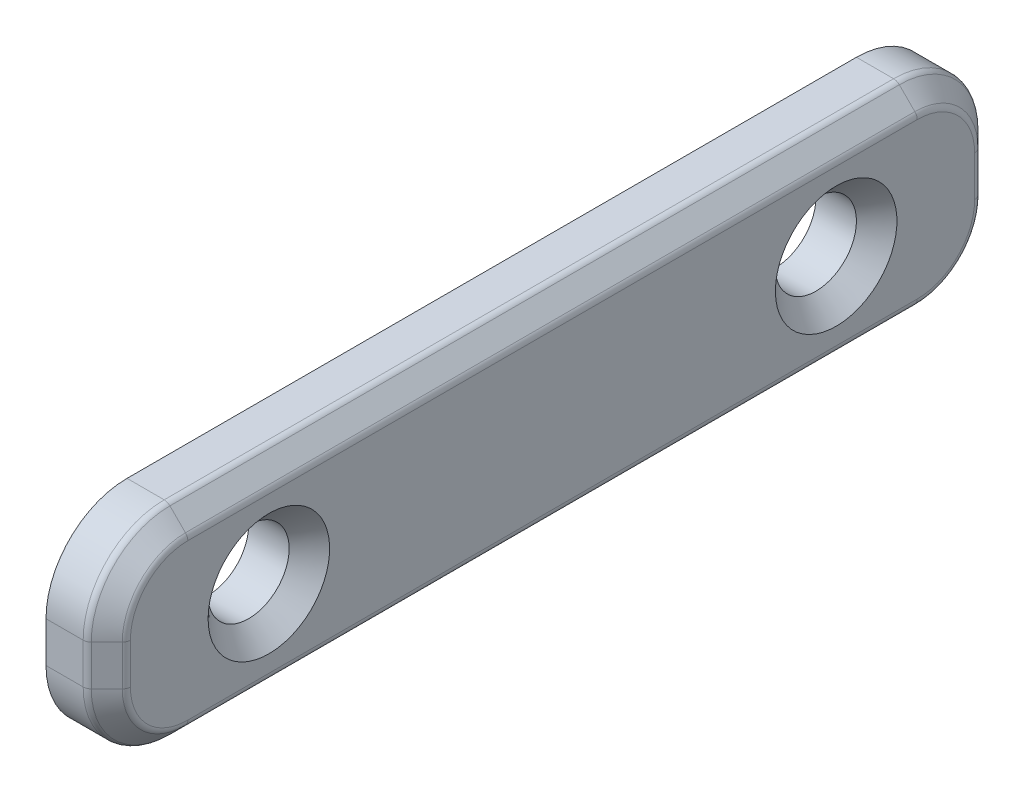
ISO-10303-21;
HEADER;
FILE_DESCRIPTION(('STEP AP214'),'2;1');
FILE_NAME('part.step','',(''),(''),'','','');
FILE_SCHEMA(('AUTOMOTIVE_DESIGN { 1 0 10303 214 1 1 1 1 }'));
ENDSEC;
DATA;
#1=APPLICATION_CONTEXT('core data for automotive mechanical design processes');
#2=APPLICATION_PROTOCOL_DEFINITION('international standard','automotive_design',2000,#1);
#3=PRODUCT_CONTEXT('',#1,'mechanical');
#4=PRODUCT('Part','Part','',(#3));
#5=PRODUCT_RELATED_PRODUCT_CATEGORY('part','',(#4));
#6=PRODUCT_DEFINITION_FORMATION('','',#4);
#7=PRODUCT_DEFINITION_CONTEXT('part definition',#1,'design');
#8=PRODUCT_DEFINITION('design','',#6,#7);
#9=PRODUCT_DEFINITION_SHAPE('','',#8);
#10=(LENGTH_UNIT() NAMED_UNIT(*) SI_UNIT(.MILLI.,.METRE.));
#11=(NAMED_UNIT(*) PLANE_ANGLE_UNIT() SI_UNIT($,.RADIAN.));
#12=(NAMED_UNIT(*) SI_UNIT($,.STERADIAN.) SOLID_ANGLE_UNIT());
#13=UNCERTAINTY_MEASURE_WITH_UNIT(LENGTH_MEASURE(1.E-05),#10,'distance_accuracy_value','');
#14=(GEOMETRIC_REPRESENTATION_CONTEXT(3) GLOBAL_UNCERTAINTY_ASSIGNED_CONTEXT((#13)) GLOBAL_UNIT_ASSIGNED_CONTEXT((#10,
#11,#12)) REPRESENTATION_CONTEXT('',''));
#15=CARTESIAN_POINT('',(0.,0.,0.));
#16=DIRECTION('',(0.,0.,1.));
#17=DIRECTION('',(1.,0.,0.));
#18=AXIS2_PLACEMENT_3D('',#15,#16,#17);
#19=CARTESIAN_POINT('',(3.,1.,-18.));
#20=DIRECTION('',(-1.,0.,0.));
#21=DIRECTION('',(0.,0.,1.));
#22=AXIS2_PLACEMENT_3D('',#19,#20,#21);
#23=PLANE('',#22);
#24=CARTESIAN_POINT('',(3.,0.,14.));
#25=DIRECTION('',(-1.,0.,0.));
#26=DIRECTION('',(0.,0.,1.));
#27=AXIS2_PLACEMENT_3D('',#24,#25,#26);
#28=CIRCLE('',#27,3.00000000000001);
#29=CARTESIAN_POINT('',(3.,0.,17.));
#30=VERTEX_POINT('',#29);
#31=EDGE_CURVE('E49',#30,#30,#28,.T.);
#32=ORIENTED_EDGE('',*,*,#31,.T.);
#33=EDGE_LOOP('',(#32));
#34=FACE_BOUND('',#33,.T.);
#35=CARTESIAN_POINT('',(3.,0.,-14.));
#36=DIRECTION('',(-1.,0.,0.));
#37=DIRECTION('',(0.,0.,1.));
#38=AXIS2_PLACEMENT_3D('',#35,#36,#37);
#39=CIRCLE('',#38,2.99999999999999);
#40=CARTESIAN_POINT('',(3.,0.,-11.));
#41=VERTEX_POINT('',#40);
#42=EDGE_CURVE('E372',#41,#41,#39,.T.);
#43=ORIENTED_EDGE('',*,*,#42,.T.);
#44=EDGE_LOOP('',(#43));
#45=FACE_BOUND('',#44,.T.);
#46=DIRECTION('',(0.,-1.,0.));
#47=VECTOR('',#46,1.);
#48=CARTESIAN_POINT('',(3.,0.999999999999971,-20.8343145750508));
#49=LINE('',#48,#47);
#50=CARTESIAN_POINT('',(3.,-1.,-20.8343145750508));
#51=VERTEX_POINT('',#50);
#52=CARTESIAN_POINT('',(3.,0.999999999999973,-20.8343145750508));
#53=VERTEX_POINT('',#52);
#54=EDGE_CURVE('E60',#51,#53,#49,.F.);
#55=ORIENTED_EDGE('',*,*,#54,.T.);
#56=CARTESIAN_POINT('',(3.,1.,-18.));
#57=DIRECTION('',(-1.,0.,0.));
#58=DIRECTION('',(0.,0.,1.));
#59=AXIS2_PLACEMENT_3D('',#56,#57,#58);
#60=CIRCLE('',#59,2.83431457505076);
#61=CARTESIAN_POINT('',(3.,3.83431457505076,-18.));
#62=VERTEX_POINT('',#61);
#63=EDGE_CURVE('E319',#53,#62,#60,.F.);
#64=ORIENTED_EDGE('',*,*,#63,.T.);
#65=DIRECTION('',(0.,0.,-1.));
#66=VECTOR('',#65,1.);
#67=CARTESIAN_POINT('',(3.,3.83431457505076,18.));
#68=LINE('',#67,#66);
#69=CARTESIAN_POINT('',(3.,3.83431457505076,18.));
#70=VERTEX_POINT('',#69);
#71=EDGE_CURVE('E306',#62,#70,#68,.F.);
#72=ORIENTED_EDGE('',*,*,#71,.T.);
#73=CARTESIAN_POINT('',(3.,1.,18.));
#74=DIRECTION('',(-1.,0.,0.));
#75=DIRECTION('',(0.,0.,1.));
#76=AXIS2_PLACEMENT_3D('',#73,#74,#75);
#77=CIRCLE('',#76,2.83431457505076);
#78=CARTESIAN_POINT('',(3.,0.999999999999972,20.8343145750508));
#79=VERTEX_POINT('',#78);
#80=EDGE_CURVE('E309',#70,#79,#77,.F.);
#81=ORIENTED_EDGE('',*,*,#80,.T.);
#82=DIRECTION('',(0.,1.,0.));
#83=VECTOR('',#82,1.);
#84=CARTESIAN_POINT('',(3.,-0.99999999999998,20.8343145750508));
#85=LINE('',#84,#83);
#86=CARTESIAN_POINT('',(3.,-0.999999999999981,20.8343145750508));
#87=VERTEX_POINT('',#86);
#88=EDGE_CURVE('E315',#79,#87,#85,.F.);
#89=ORIENTED_EDGE('',*,*,#88,.T.);
#90=CARTESIAN_POINT('',(3.,-1.,18.));
#91=DIRECTION('',(-1.,0.,0.));
#92=DIRECTION('',(0.,0.,1.));
#93=AXIS2_PLACEMENT_3D('',#90,#91,#92);
#94=CIRCLE('',#93,2.83431457505076);
#95=CARTESIAN_POINT('',(3.,-3.83431457505076,18.));
#96=VERTEX_POINT('',#95);
#97=EDGE_CURVE('E314',#87,#96,#94,.F.);
#98=ORIENTED_EDGE('',*,*,#97,.T.);
#99=DIRECTION('',(0.,0.,1.));
#100=VECTOR('',#99,1.);
#101=CARTESIAN_POINT('',(3.,-3.83431457505076,-18.));
#102=LINE('',#101,#100);
#103=CARTESIAN_POINT('',(3.,-3.83431457505076,-18.));
#104=VERTEX_POINT('',#103);
#105=EDGE_CURVE('E316',#96,#104,#102,.F.);
#106=ORIENTED_EDGE('',*,*,#105,.T.);
#107=CARTESIAN_POINT('',(3.,-1.,-18.));
#108=DIRECTION('',(-1.,0.,0.));
#109=DIRECTION('',(0.,0.,1.));
#110=AXIS2_PLACEMENT_3D('',#107,#108,#109);
#111=CIRCLE('',#110,2.83431457505076);
#112=EDGE_CURVE('E64',#104,#51,#111,.F.);
#113=ORIENTED_EDGE('',*,*,#112,.T.);
#114=EDGE_LOOP('',(#55,#64,#72,#81,#89,#98,#106,#113));
#115=FACE_BOUND('',#114,.T.);
#116=ADVANCED_FACE('F41',(#34,#45,#115),#23,.F.);
#117=CARTESIAN_POINT('',(0.,1.,-18.));
#118=DIRECTION('',(-1.,0.,0.));
#119=DIRECTION('',(0.,0.,1.));
#120=AXIS2_PLACEMENT_3D('',#117,#118,#119);
#121=PLANE('',#120);
#122=CARTESIAN_POINT('',(0.,0.,-14.));
#123=DIRECTION('',(1.,0.,0.));
#124=DIRECTION('',(0.,0.,-1.));
#125=AXIS2_PLACEMENT_3D('',#122,#123,#124);
#126=CIRCLE('',#125,2.);
#127=CARTESIAN_POINT('',(0.,0.,-16.));
#128=VERTEX_POINT('',#127);
#129=EDGE_CURVE('E213',#128,#128,#126,.F.);
#130=ORIENTED_EDGE('',*,*,#129,.F.);
#131=EDGE_LOOP('',(#130));
#132=FACE_BOUND('',#131,.T.);
#133=CARTESIAN_POINT('',(0.,1.,-18.));
#134=DIRECTION('',(1.,0.,0.));
#135=DIRECTION('',(0.,0.,1.));
#136=AXIS2_PLACEMENT_3D('',#133,#134,#135);
#137=CIRCLE('',#136,4.);
#138=CARTESIAN_POINT('',(0.,0.999999999999971,-22.));
#139=VERTEX_POINT('',#138);
#140=CARTESIAN_POINT('',(0.,5.,-18.));
#141=VERTEX_POINT('',#140);
#142=EDGE_CURVE('E196',#139,#141,#137,.T.);
#143=ORIENTED_EDGE('',*,*,#142,.F.);
#144=DIRECTION('',(0.,1.,0.));
#145=VECTOR('',#144,1.);
#146=CARTESIAN_POINT('',(0.,-0.999999999999972,-22.));
#147=LINE('',#146,#145);
#148=CARTESIAN_POINT('',(0.,-1.,-22.));
#149=VERTEX_POINT('',#148);
#150=EDGE_CURVE('E230',#149,#139,#147,.T.);
#151=ORIENTED_EDGE('',*,*,#150,.F.);
#152=CARTESIAN_POINT('',(0.,-1.,-18.));
#153=DIRECTION('',(1.,0.,0.));
#154=DIRECTION('',(0.,0.,-1.));
#155=AXIS2_PLACEMENT_3D('',#152,#153,#154);
#156=CIRCLE('',#155,4.);
#157=CARTESIAN_POINT('',(0.,-5.,-18.));
#158=VERTEX_POINT('',#157);
#159=EDGE_CURVE('E228',#158,#149,#156,.T.);
#160=ORIENTED_EDGE('',*,*,#159,.F.);
#161=DIRECTION('',(0.,0.,-1.));
#162=VECTOR('',#161,1.);
#163=CARTESIAN_POINT('',(0.,-5.,18.));
#164=LINE('',#163,#162);
#165=CARTESIAN_POINT('',(0.,-5.,18.));
#166=VERTEX_POINT('',#165);
#167=EDGE_CURVE('E224',#166,#158,#164,.T.);
#168=ORIENTED_EDGE('',*,*,#167,.F.);
#169=CARTESIAN_POINT('',(0.,-1.,18.));
#170=DIRECTION('',(1.,0.,0.));
#171=DIRECTION('',(0.,0.,1.));
#172=AXIS2_PLACEMENT_3D('',#169,#170,#171);
#173=CIRCLE('',#172,4.);
#174=CARTESIAN_POINT('',(0.,-0.999999999999972,22.));
#175=VERTEX_POINT('',#174);
#176=EDGE_CURVE('E219',#175,#166,#173,.T.);
#177=ORIENTED_EDGE('',*,*,#176,.F.);
#178=DIRECTION('',(0.,-1.,0.));
#179=VECTOR('',#178,1.);
#180=CARTESIAN_POINT('',(0.,-0.999999999999972,22.));
#181=LINE('',#180,#179);
#182=CARTESIAN_POINT('',(0.,0.999999999999972,22.));
#183=VERTEX_POINT('',#182);
#184=EDGE_CURVE('E220',#183,#175,#181,.T.);
#185=ORIENTED_EDGE('',*,*,#184,.F.);
#186=CARTESIAN_POINT('',(0.,1.,18.));
#187=DIRECTION('',(1.,0.,0.));
#188=DIRECTION('',(0.,0.,-1.));
#189=AXIS2_PLACEMENT_3D('',#186,#187,#188);
#190=CIRCLE('',#189,4.);
#191=CARTESIAN_POINT('',(0.,5.,18.));
#192=VERTEX_POINT('',#191);
#193=EDGE_CURVE('E203',#192,#183,#190,.T.);
#194=ORIENTED_EDGE('',*,*,#193,.F.);
#195=DIRECTION('',(0.,0.,1.));
#196=VECTOR('',#195,1.);
#197=CARTESIAN_POINT('',(0.,5.,18.));
#198=LINE('',#197,#196);
#199=EDGE_CURVE('E181',#141,#192,#198,.T.);
#200=ORIENTED_EDGE('',*,*,#199,.F.);
#201=EDGE_LOOP('',(#143,#151,#160,#168,#177,#185,#194,#200));
#202=FACE_BOUND('',#201,.T.);
#203=CARTESIAN_POINT('',(0.,0.,14.));
#204=DIRECTION('',(1.,0.,0.));
#205=DIRECTION('',(0.,0.,-1.));
#206=AXIS2_PLACEMENT_3D('',#203,#204,#205);
#207=CIRCLE('',#206,2.);
#208=CARTESIAN_POINT('',(0.,0.,12.));
#209=VERTEX_POINT('',#208);
#210=EDGE_CURVE('E352',#209,#209,#207,.T.);
#211=ORIENTED_EDGE('',*,*,#210,.T.);
#212=EDGE_LOOP('',(#211));
#213=FACE_BOUND('',#212,.T.);
#214=ADVANCED_FACE('F194',(#132,#202,#213),#121,.T.);
#215=CARTESIAN_POINT('',(3.,1.,-18.));
#216=DIRECTION('',(-1.,0.,0.));
#217=DIRECTION('',(0.,0.,1.));
#218=AXIS2_PLACEMENT_3D('',#215,#216,#217);
#219=CYLINDRICAL_SURFACE('',#218,4.);
#220=DIRECTION('',(-1.,0.,0.));
#221=VECTOR('',#220,1.);
#222=CARTESIAN_POINT('',(3.,5.,-18.));
#223=LINE('',#222,#221);
#224=CARTESIAN_POINT('',(1.83431457505075,5.,-18.));
#225=VERTEX_POINT('',#224);
#226=EDGE_CURVE('E177',#225,#141,#223,.T.);
#227=ORIENTED_EDGE('',*,*,#226,.F.);
#228=CARTESIAN_POINT('',(1.83431457505075,1.,-18.));
#229=DIRECTION('',(1.,0.,0.));
#230=DIRECTION('',(0.,0.,-1.));
#231=AXIS2_PLACEMENT_3D('',#228,#229,#230);
#232=CIRCLE('',#231,4.);
#233=CARTESIAN_POINT('',(1.83431457505075,0.999999999999971,-22.));
#234=VERTEX_POINT('',#233);
#235=EDGE_CURVE('E303',#225,#234,#232,.F.);
#236=ORIENTED_EDGE('',*,*,#235,.T.);
#237=DIRECTION('',(-1.,0.,0.));
#238=VECTOR('',#237,1.);
#239=CARTESIAN_POINT('',(3.,0.999999999999971,-22.));
#240=LINE('',#239,#238);
#241=EDGE_CURVE('E202',#234,#139,#240,.T.);
#242=ORIENTED_EDGE('',*,*,#241,.T.);
#243=ORIENTED_EDGE('',*,*,#142,.T.);
#244=EDGE_LOOP('',(#227,#236,#242,#243));
#245=FACE_BOUND('',#244,.T.);
#246=ADVANCED_FACE('F201',(#245),#219,.T.);
#247=CARTESIAN_POINT('',(3.,5.,18.));
#248=DIRECTION('',(0.,-1.,0.));
#249=DIRECTION('',(0.,0.,-1.));
#250=AXIS2_PLACEMENT_3D('',#247,#248,#249);
#251=PLANE('',#250);
#252=DIRECTION('',(-1.,0.,0.));
#253=VECTOR('',#252,1.);
#254=CARTESIAN_POINT('',(3.,5.,18.));
#255=LINE('',#254,#253);
#256=CARTESIAN_POINT('',(1.83431457505075,5.,18.));
#257=VERTEX_POINT('',#256);
#258=EDGE_CURVE('E193',#257,#192,#255,.T.);
#259=ORIENTED_EDGE('',*,*,#258,.F.);
#260=DIRECTION('',(0.,0.,1.));
#261=VECTOR('',#260,1.);
#262=CARTESIAN_POINT('',(1.83431457505075,5.,-18.));
#263=LINE('',#262,#261);
#264=EDGE_CURVE('E186',#257,#225,#263,.F.);
#265=ORIENTED_EDGE('',*,*,#264,.T.);
#266=ORIENTED_EDGE('',*,*,#226,.T.);
#267=ORIENTED_EDGE('',*,*,#199,.T.);
#268=EDGE_LOOP('',(#259,#265,#266,#267));
#269=FACE_BOUND('',#268,.T.);
#270=ADVANCED_FACE('F185',(#269),#251,.F.);
#271=CARTESIAN_POINT('',(3.,1.,18.));
#272=DIRECTION('',(-1.,0.,0.));
#273=DIRECTION('',(0.,0.,1.));
#274=AXIS2_PLACEMENT_3D('',#271,#272,#273);
#275=CYLINDRICAL_SURFACE('',#274,4.);
#276=DIRECTION('',(-1.,0.,0.));
#277=VECTOR('',#276,1.);
#278=CARTESIAN_POINT('',(3.,0.999999999999972,22.));
#279=LINE('',#278,#277);
#280=CARTESIAN_POINT('',(1.83431457505075,0.999999999999972,22.));
#281=VERTEX_POINT('',#280);
#282=EDGE_CURVE('E238',#281,#183,#279,.T.);
#283=ORIENTED_EDGE('',*,*,#282,.F.);
#284=CARTESIAN_POINT('',(1.83431457505075,1.,18.));
#285=DIRECTION('',(1.,0.,0.));
#286=DIRECTION('',(0.,0.,-1.));
#287=AXIS2_PLACEMENT_3D('',#284,#285,#286);
#288=CIRCLE('',#287,4.);
#289=EDGE_CURVE('E189',#281,#257,#288,.F.);
#290=ORIENTED_EDGE('',*,*,#289,.T.);
#291=ORIENTED_EDGE('',*,*,#258,.T.);
#292=ORIENTED_EDGE('',*,*,#193,.T.);
#293=EDGE_LOOP('',(#283,#290,#291,#292));
#294=FACE_BOUND('',#293,.T.);
#295=ADVANCED_FACE('F428',(#294),#275,.T.);
#296=CARTESIAN_POINT('',(3.,-0.999999999999972,22.));
#297=DIRECTION('',(0.,0.,-1.));
#298=DIRECTION('',(-1.,0.,0.));
#299=AXIS2_PLACEMENT_3D('',#296,#297,#298);
#300=PLANE('',#299);
#301=DIRECTION('',(-1.,0.,0.));
#302=VECTOR('',#301,1.);
#303=CARTESIAN_POINT('',(3.,-0.999999999999972,22.));
#304=LINE('',#303,#302);
#305=CARTESIAN_POINT('',(1.83431457505075,-0.999999999999972,22.));
#306=VERTEX_POINT('',#305);
#307=EDGE_CURVE('E236',#306,#175,#304,.T.);
#308=ORIENTED_EDGE('',*,*,#307,.F.);
#309=DIRECTION('',(0.,-1.,0.));
#310=VECTOR('',#309,1.);
#311=CARTESIAN_POINT('',(1.83431457505075,0.999999999999972,22.));
#312=LINE('',#311,#310);
#313=EDGE_CURVE('E271',#306,#281,#312,.F.);
#314=ORIENTED_EDGE('',*,*,#313,.T.);
#315=ORIENTED_EDGE('',*,*,#282,.T.);
#316=ORIENTED_EDGE('',*,*,#184,.T.);
#317=EDGE_LOOP('',(#308,#314,#315,#316));
#318=FACE_BOUND('',#317,.T.);
#319=ADVANCED_FACE('F424',(#318),#300,.F.);
#320=CARTESIAN_POINT('',(3.,-1.,18.));
#321=DIRECTION('',(-1.,0.,0.));
#322=DIRECTION('',(0.,0.,1.));
#323=AXIS2_PLACEMENT_3D('',#320,#321,#322);
#324=CYLINDRICAL_SURFACE('',#323,4.);
#325=DIRECTION('',(-1.,0.,0.));
#326=VECTOR('',#325,1.);
#327=CARTESIAN_POINT('',(3.,-5.,18.));
#328=LINE('',#327,#326);
#329=CARTESIAN_POINT('',(1.83431457505075,-5.,18.));
#330=VERTEX_POINT('',#329);
#331=EDGE_CURVE('E237',#330,#166,#328,.T.);
#332=ORIENTED_EDGE('',*,*,#331,.F.);
#333=CARTESIAN_POINT('',(1.83431457505075,-1.,18.));
#334=DIRECTION('',(1.,0.,0.));
#335=DIRECTION('',(0.,0.,-1.));
#336=AXIS2_PLACEMENT_3D('',#333,#334,#335);
#337=CIRCLE('',#336,4.);
#338=EDGE_CURVE('E280',#330,#306,#337,.F.);
#339=ORIENTED_EDGE('',*,*,#338,.T.);
#340=ORIENTED_EDGE('',*,*,#307,.T.);
#341=ORIENTED_EDGE('',*,*,#176,.T.);
#342=EDGE_LOOP('',(#332,#339,#340,#341));
#343=FACE_BOUND('',#342,.T.);
#344=ADVANCED_FACE('F419',(#343),#324,.T.);
#345=CARTESIAN_POINT('',(3.,-5.,18.));
#346=DIRECTION('',(0.,1.,0.));
#347=DIRECTION('',(0.,0.,1.));
#348=AXIS2_PLACEMENT_3D('',#345,#346,#347);
#349=PLANE('',#348);
#350=DIRECTION('',(-1.,0.,0.));
#351=VECTOR('',#350,1.);
#352=CARTESIAN_POINT('',(3.,-5.,-18.));
#353=LINE('',#352,#351);
#354=CARTESIAN_POINT('',(1.83431457505075,-5.,-18.));
#355=VERTEX_POINT('',#354);
#356=EDGE_CURVE('E232',#355,#158,#353,.T.);
#357=ORIENTED_EDGE('',*,*,#356,.F.);
#358=DIRECTION('',(0.,0.,-1.));
#359=VECTOR('',#358,1.);
#360=CARTESIAN_POINT('',(1.83431457505075,-5.,18.));
#361=LINE('',#360,#359);
#362=EDGE_CURVE('E282',#355,#330,#361,.F.);
#363=ORIENTED_EDGE('',*,*,#362,.T.);
#364=ORIENTED_EDGE('',*,*,#331,.T.);
#365=ORIENTED_EDGE('',*,*,#167,.T.);
#366=EDGE_LOOP('',(#357,#363,#364,#365));
#367=FACE_BOUND('',#366,.T.);
#368=ADVANCED_FACE('F418',(#367),#349,.F.);
#369=CARTESIAN_POINT('',(3.,-1.,-18.));
#370=DIRECTION('',(-1.,0.,0.));
#371=DIRECTION('',(0.,0.,1.));
#372=AXIS2_PLACEMENT_3D('',#369,#370,#371);
#373=CYLINDRICAL_SURFACE('',#372,4.);
#374=DIRECTION('',(-1.,0.,0.));
#375=VECTOR('',#374,1.);
#376=CARTESIAN_POINT('',(3.,-1.,-22.));
#377=LINE('',#376,#375);
#378=CARTESIAN_POINT('',(1.83431457505075,-1.,-22.));
#379=VERTEX_POINT('',#378);
#380=EDGE_CURVE('E235',#379,#149,#377,.T.);
#381=ORIENTED_EDGE('',*,*,#380,.F.);
#382=CARTESIAN_POINT('',(1.83431457505075,-1.,-18.));
#383=DIRECTION('',(1.,0.,0.));
#384=DIRECTION('',(0.,0.,-1.));
#385=AXIS2_PLACEMENT_3D('',#382,#383,#384);
#386=CIRCLE('',#385,4.);
#387=EDGE_CURVE('E287',#379,#355,#386,.F.);
#388=ORIENTED_EDGE('',*,*,#387,.T.);
#389=ORIENTED_EDGE('',*,*,#356,.T.);
#390=ORIENTED_EDGE('',*,*,#159,.T.);
#391=EDGE_LOOP('',(#381,#388,#389,#390));
#392=FACE_BOUND('',#391,.T.);
#393=ADVANCED_FACE('F415',(#392),#373,.T.);
#394=CARTESIAN_POINT('',(3.,-0.999999999999972,-22.));
#395=DIRECTION('',(0.,0.,1.));
#396=DIRECTION('',(1.,0.,0.));
#397=AXIS2_PLACEMENT_3D('',#394,#395,#396);
#398=PLANE('',#397);
#399=ORIENTED_EDGE('',*,*,#241,.F.);
#400=DIRECTION('',(0.,1.,0.));
#401=VECTOR('',#400,1.);
#402=CARTESIAN_POINT('',(1.83431457505075,-1.,-22.));
#403=LINE('',#402,#401);
#404=EDGE_CURVE('E293',#234,#379,#403,.F.);
#405=ORIENTED_EDGE('',*,*,#404,.T.);
#406=ORIENTED_EDGE('',*,*,#380,.T.);
#407=ORIENTED_EDGE('',*,*,#150,.T.);
#408=EDGE_LOOP('',(#399,#405,#406,#407));
#409=FACE_BOUND('',#408,.T.);
#410=ADVANCED_FACE('F407',(#409),#398,.F.);
#411=CARTESIAN_POINT('',(3.,1.,21.));
#412=DIRECTION('',(-0.707106781186545,0.,-0.70710678118655));
#413=DIRECTION('',(0.,-1.,0.));
#414=AXIS2_PLACEMENT_3D('',#411,#412,#413);
#415=PLANE('',#414);
#416=DIRECTION('',(0.70710678118655,0.,-0.707106781186545));
#417=VECTOR('',#416,1.);
#418=CARTESIAN_POINT('',(1.99999999999999,0.999999999999972,22.));
#419=LINE('',#418,#417);
#420=CARTESIAN_POINT('',(2.11715728752537,0.999999999999972,21.8828427124746));
#421=VERTEX_POINT('',#420);
#422=CARTESIAN_POINT('',(2.88284271247462,0.999999999999972,21.1171572875254));
#423=VERTEX_POINT('',#422);
#424=EDGE_CURVE('E209',#421,#423,#419,.T.);
#425=ORIENTED_EDGE('',*,*,#424,.F.);
#426=DIRECTION('',(0.,1.,0.));
#427=VECTOR('',#426,1.);
#428=CARTESIAN_POINT('',(2.11715728752537,-0.999999999999972,21.8828427124746));
#429=LINE('',#428,#427);
#430=CARTESIAN_POINT('',(2.11715728752537,-0.999999999999973,21.8828427124746));
#431=VERTEX_POINT('',#430);
#432=EDGE_CURVE('E274',#421,#431,#429,.F.);
#433=ORIENTED_EDGE('',*,*,#432,.T.);
#434=DIRECTION('',(-0.70710678118655,0.,0.707106781186545));
#435=VECTOR('',#434,1.);
#436=CARTESIAN_POINT('',(3.,-0.99999999999998,21.));
#437=LINE('',#436,#435);
#438=CARTESIAN_POINT('',(2.88284271247461,-0.999999999999979,21.1171572875254));
#439=VERTEX_POINT('',#438);
#440=EDGE_CURVE('E210',#439,#431,#437,.T.);
#441=ORIENTED_EDGE('',*,*,#440,.F.);
#442=DIRECTION('',(0.,-1.,0.));
#443=VECTOR('',#442,1.);
#444=CARTESIAN_POINT('',(2.88284271247461,0.999999999999972,21.1171572875254));
#445=LINE('',#444,#443);
#446=EDGE_CURVE('E272',#439,#423,#445,.F.);
#447=ORIENTED_EDGE('',*,*,#446,.T.);
#448=EDGE_LOOP('',(#425,#433,#441,#447));
#449=FACE_BOUND('',#448,.T.);
#450=ADVANCED_FACE('F413',(#449),#415,.F.);
#451=CARTESIAN_POINT('',(3.,-1.,18.));
#452=DIRECTION('',(-1.,0.,0.));
#453=DIRECTION('',(0.,0.,1.));
#454=AXIS2_PLACEMENT_3D('',#451,#452,#453);
#455=CONICAL_SURFACE('',#454,3.,0.785398163397445);
#456=ORIENTED_EDGE('',*,*,#440,.T.);
#457=CARTESIAN_POINT('',(2.11715728752537,-1.,18.));
#458=DIRECTION('',(-1.,0.,0.));
#459=DIRECTION('',(0.,0.,1.));
#460=AXIS2_PLACEMENT_3D('',#457,#458,#459);
#461=CIRCLE('',#460,3.88284271247462);
#462=CARTESIAN_POINT('',(2.11715728752537,-4.88284271247462,18.));
#463=VERTEX_POINT('',#462);
#464=EDGE_CURVE('E283',#431,#463,#461,.F.);
#465=ORIENTED_EDGE('',*,*,#464,.T.);
#466=DIRECTION('',(-0.70710678118655,-0.707106781186545,0.));
#467=VECTOR('',#466,1.);
#468=CARTESIAN_POINT('',(3.,-4.,18.));
#469=LINE('',#468,#467);
#470=CARTESIAN_POINT('',(2.88284271247462,-4.11715728752538,18.));
#471=VERTEX_POINT('',#470);
#472=EDGE_CURVE('E259',#471,#463,#469,.T.);
#473=ORIENTED_EDGE('',*,*,#472,.F.);
#474=CARTESIAN_POINT('',(2.88284271247462,-1.,18.));
#475=DIRECTION('',(-1.,0.,0.));
#476=DIRECTION('',(0.,0.,1.));
#477=AXIS2_PLACEMENT_3D('',#474,#475,#476);
#478=CIRCLE('',#477,3.11715728752538);
#479=EDGE_CURVE('E276',#471,#439,#478,.T.);
#480=ORIENTED_EDGE('',*,*,#479,.T.);
#481=EDGE_LOOP('',(#456,#465,#473,#480));
#482=FACE_BOUND('',#481,.T.);
#483=ADVANCED_FACE('F479',(#482),#455,.T.);
#484=CARTESIAN_POINT('',(3.,1.,18.));
#485=DIRECTION('',(-1.,0.,0.));
#486=DIRECTION('',(0.,0.,1.));
#487=AXIS2_PLACEMENT_3D('',#484,#485,#486);
#488=CONICAL_SURFACE('',#487,3.,0.785398163397444);
#489=DIRECTION('',(0.707106781186551,-0.707106781186544,0.));
#490=VECTOR('',#489,1.);
#491=CARTESIAN_POINT('',(1.99999999999999,5.,18.));
#492=LINE('',#491,#490);
#493=CARTESIAN_POINT('',(2.11715728752537,4.88284271247462,18.));
#494=VERTEX_POINT('',#493);
#495=CARTESIAN_POINT('',(2.88284271247462,4.11715728752538,18.));
#496=VERTEX_POINT('',#495);
#497=EDGE_CURVE('E258',#494,#496,#492,.T.);
#498=ORIENTED_EDGE('',*,*,#497,.F.);
#499=CARTESIAN_POINT('',(2.11715728752537,1.,18.));
#500=DIRECTION('',(-1.,0.,0.));
#501=DIRECTION('',(0.,0.,1.));
#502=AXIS2_PLACEMENT_3D('',#499,#500,#501);
#503=CIRCLE('',#502,3.88284271247462);
#504=EDGE_CURVE('E268',#494,#421,#503,.F.);
#505=ORIENTED_EDGE('',*,*,#504,.T.);
#506=ORIENTED_EDGE('',*,*,#424,.T.);
#507=CARTESIAN_POINT('',(2.88284271247462,1.,18.));
#508=DIRECTION('',(-1.,0.,0.));
#509=DIRECTION('',(0.,0.,1.));
#510=AXIS2_PLACEMENT_3D('',#507,#508,#509);
#511=CIRCLE('',#510,3.11715728752538);
#512=EDGE_CURVE('E266',#423,#496,#511,.T.);
#513=ORIENTED_EDGE('',*,*,#512,.T.);
#514=EDGE_LOOP('',(#498,#505,#506,#513));
#515=FACE_BOUND('',#514,.T.);
#516=ADVANCED_FACE('F472',(#515),#488,.T.);
#517=CARTESIAN_POINT('',(3.,-4.,-18.));
#518=DIRECTION('',(-0.707106781186544,0.707106781186551,0.));
#519=DIRECTION('',(0.,0.,-1.));
#520=AXIS2_PLACEMENT_3D('',#517,#518,#519);
#521=PLANE('',#520);
#522=ORIENTED_EDGE('',*,*,#472,.T.);
#523=DIRECTION('',(0.,0.,1.));
#524=VECTOR('',#523,1.);
#525=CARTESIAN_POINT('',(2.11715728752537,-4.88284271247462,-18.));
#526=LINE('',#525,#524);
#527=CARTESIAN_POINT('',(2.11715728752537,-4.88284271247462,-18.));
#528=VERTEX_POINT('',#527);
#529=EDGE_CURVE('E290',#463,#528,#526,.F.);
#530=ORIENTED_EDGE('',*,*,#529,.T.);
#531=DIRECTION('',(-0.707106781186551,-0.707106781186544,0.));
#532=VECTOR('',#531,1.);
#533=CARTESIAN_POINT('',(3.,-4.,-18.));
#534=LINE('',#533,#532);
#535=CARTESIAN_POINT('',(2.88284271247462,-4.11715728752538,-18.));
#536=VERTEX_POINT('',#535);
#537=EDGE_CURVE('E251',#536,#528,#534,.T.);
#538=ORIENTED_EDGE('',*,*,#537,.F.);
#539=DIRECTION('',(0.,0.,-1.));
#540=VECTOR('',#539,1.);
#541=CARTESIAN_POINT('',(2.88284271247462,-4.11715728752538,18.));
#542=LINE('',#541,#540);
#543=EDGE_CURVE('E281',#536,#471,#542,.F.);
#544=ORIENTED_EDGE('',*,*,#543,.T.);
#545=EDGE_LOOP('',(#522,#530,#538,#544));
#546=FACE_BOUND('',#545,.T.);
#547=ADVANCED_FACE('F464',(#546),#521,.F.);
#548=CARTESIAN_POINT('',(3.,4.,-18.));
#549=DIRECTION('',(-0.707106781186544,-0.707106781186551,0.));
#550=DIRECTION('',(0.,0.,1.));
#551=AXIS2_PLACEMENT_3D('',#548,#549,#550);
#552=PLANE('',#551);
#553=DIRECTION('',(0.707106781186551,-0.707106781186544,0.));
#554=VECTOR('',#553,1.);
#555=CARTESIAN_POINT('',(1.99999999999999,5.,-18.));
#556=LINE('',#555,#554);
#557=CARTESIAN_POINT('',(2.11715728752537,4.88284271247462,-18.));
#558=VERTEX_POINT('',#557);
#559=CARTESIAN_POINT('',(2.88284271247462,4.11715728752538,-18.));
#560=VERTEX_POINT('',#559);
#561=EDGE_CURVE('E249',#558,#560,#556,.T.);
#562=ORIENTED_EDGE('',*,*,#561,.F.);
#563=DIRECTION('',(0.,0.,-1.));
#564=VECTOR('',#563,1.);
#565=CARTESIAN_POINT('',(2.11715728752537,4.88284271247462,18.));
#566=LINE('',#565,#564);
#567=EDGE_CURVE('E324',#558,#494,#566,.F.);
#568=ORIENTED_EDGE('',*,*,#567,.T.);
#569=ORIENTED_EDGE('',*,*,#497,.T.);
#570=DIRECTION('',(0.,0.,1.));
#571=VECTOR('',#570,1.);
#572=CARTESIAN_POINT('',(2.88284271247462,4.11715728752538,-18.));
#573=LINE('',#572,#571);
#574=EDGE_CURVE('E323',#496,#560,#573,.F.);
#575=ORIENTED_EDGE('',*,*,#574,.T.);
#576=EDGE_LOOP('',(#562,#568,#569,#575));
#577=FACE_BOUND('',#576,.T.);
#578=ADVANCED_FACE('F456',(#577),#552,.F.);
#579=CARTESIAN_POINT('',(3.,-1.,-18.));
#580=DIRECTION('',(-1.,0.,0.));
#581=DIRECTION('',(0.,0.,1.));
#582=AXIS2_PLACEMENT_3D('',#579,#580,#581);
#583=CONICAL_SURFACE('',#582,3.,0.785398163397444);
#584=ORIENTED_EDGE('',*,*,#537,.T.);
#585=CARTESIAN_POINT('',(2.11715728752537,-1.,-18.));
#586=DIRECTION('',(-1.,0.,0.));
#587=DIRECTION('',(0.,0.,1.));
#588=AXIS2_PLACEMENT_3D('',#585,#586,#587);
#589=CIRCLE('',#588,3.88284271247462);
#590=CARTESIAN_POINT('',(2.11715728752537,-1.,-21.8828427124746));
#591=VERTEX_POINT('',#590);
#592=EDGE_CURVE('E291',#528,#591,#589,.F.);
#593=ORIENTED_EDGE('',*,*,#592,.T.);
#594=DIRECTION('',(-0.70710678118655,0.,-0.707106781186545));
#595=VECTOR('',#594,1.);
#596=CARTESIAN_POINT('',(3.,-1.,-21.));
#597=LINE('',#596,#595);
#598=CARTESIAN_POINT('',(2.88284271247462,-1.,-21.1171572875254));
#599=VERTEX_POINT('',#598);
#600=EDGE_CURVE('E248',#599,#591,#597,.T.);
#601=ORIENTED_EDGE('',*,*,#600,.F.);
#602=CARTESIAN_POINT('',(2.88284271247462,-1.,-18.));
#603=DIRECTION('',(-1.,0.,0.));
#604=DIRECTION('',(0.,0.,1.));
#605=AXIS2_PLACEMENT_3D('',#602,#603,#604);
#606=CIRCLE('',#605,3.11715728752538);
#607=EDGE_CURVE('E292',#599,#536,#606,.T.);
#608=ORIENTED_EDGE('',*,*,#607,.T.);
#609=EDGE_LOOP('',(#584,#593,#601,#608));
#610=FACE_BOUND('',#609,.T.);
#611=ADVANCED_FACE('F451',(#610),#583,.T.);
#612=CARTESIAN_POINT('',(3.,1.,-18.));
#613=DIRECTION('',(-1.,0.,0.));
#614=DIRECTION('',(0.,0.,1.));
#615=AXIS2_PLACEMENT_3D('',#612,#613,#614);
#616=CONICAL_SURFACE('',#615,3.,0.785398163397445);
#617=DIRECTION('',(0.70710678118655,0.,0.707106781186545));
#618=VECTOR('',#617,1.);
#619=CARTESIAN_POINT('',(1.99999999999999,0.999999999999971,-22.));
#620=LINE('',#619,#618);
#621=CARTESIAN_POINT('',(2.11715728752537,0.999999999999971,-21.8828427124746));
#622=VERTEX_POINT('',#621);
#623=CARTESIAN_POINT('',(2.88284271247462,0.999999999999971,-21.1171572875254));
#624=VERTEX_POINT('',#623);
#625=EDGE_CURVE('E242',#622,#624,#620,.T.);
#626=ORIENTED_EDGE('',*,*,#625,.F.);
#627=CARTESIAN_POINT('',(2.11715728752537,1.,-18.));
#628=DIRECTION('',(-1.,0.,0.));
#629=DIRECTION('',(0.,0.,1.));
#630=AXIS2_PLACEMENT_3D('',#627,#628,#629);
#631=CIRCLE('',#630,3.88284271247462);
#632=EDGE_CURVE('E308',#622,#558,#631,.F.);
#633=ORIENTED_EDGE('',*,*,#632,.T.);
#634=ORIENTED_EDGE('',*,*,#561,.T.);
#635=CARTESIAN_POINT('',(2.88284271247462,1.,-18.));
#636=DIRECTION('',(-1.,0.,0.));
#637=DIRECTION('',(0.,0.,1.));
#638=AXIS2_PLACEMENT_3D('',#635,#636,#637);
#639=CIRCLE('',#638,3.11715728752538);
#640=EDGE_CURVE('E301',#560,#624,#639,.T.);
#641=ORIENTED_EDGE('',*,*,#640,.T.);
#642=EDGE_LOOP('',(#626,#633,#634,#641));
#643=FACE_BOUND('',#642,.T.);
#644=ADVANCED_FACE('F441',(#643),#616,.T.);
#645=CARTESIAN_POINT('',(3.,1.,-21.));
#646=DIRECTION('',(-0.707106781186545,0.,0.70710678118655));
#647=DIRECTION('',(0.,1.,0.));
#648=AXIS2_PLACEMENT_3D('',#645,#646,#647);
#649=PLANE('',#648);
#650=ORIENTED_EDGE('',*,*,#600,.T.);
#651=DIRECTION('',(0.,-1.,0.));
#652=VECTOR('',#651,1.);
#653=CARTESIAN_POINT('',(2.11715728752537,0.999999999999971,-21.8828427124746));
#654=LINE('',#653,#652);
#655=EDGE_CURVE('E298',#591,#622,#654,.F.);
#656=ORIENTED_EDGE('',*,*,#655,.T.);
#657=ORIENTED_EDGE('',*,*,#625,.T.);
#658=DIRECTION('',(0.,1.,0.));
#659=VECTOR('',#658,1.);
#660=CARTESIAN_POINT('',(2.88284271247462,-1.,-21.1171572875254));
#661=LINE('',#660,#659);
#662=EDGE_CURVE('E300',#624,#599,#661,.F.);
#663=ORIENTED_EDGE('',*,*,#662,.T.);
#664=EDGE_LOOP('',(#650,#656,#657,#663));
#665=FACE_BOUND('',#664,.T.);
#666=ADVANCED_FACE('F436',(#665),#649,.F.);
#667=CARTESIAN_POINT('',(1.83431457505075,-1.,-18.));
#668=DIRECTION('',(1.,0.,0.));
#669=DIRECTION('',(0.,0.,-1.));
#670=AXIS2_PLACEMENT_3D('',#667,#668,#669);
#671=TOROIDAL_SURFACE('',#670,3.6,0.4);
#672=CARTESIAN_POINT('',(1.83431457505075,-1.,-21.6));
#673=DIRECTION('',(0.,1.,0.));
#674=DIRECTION('',(0.,0.,1.));
#675=AXIS2_PLACEMENT_3D('',#672,#673,#674);
#676=CIRCLE('',#675,0.4);
#677=EDGE_CURVE('E344',#591,#379,#676,.T.);
#678=ORIENTED_EDGE('',*,*,#677,.F.);
#679=ORIENTED_EDGE('',*,*,#592,.F.);
#680=CARTESIAN_POINT('',(1.83431457505075,-4.6,-18.));
#681=DIRECTION('',(0.,0.,1.));
#682=DIRECTION('',(0.,-1.,0.));
#683=AXIS2_PLACEMENT_3D('',#680,#681,#682);
#684=CIRCLE('',#683,0.4);
#685=EDGE_CURVE('E250',#355,#528,#684,.T.);
#686=ORIENTED_EDGE('',*,*,#685,.F.);
#687=ORIENTED_EDGE('',*,*,#387,.F.);
#688=EDGE_LOOP('',(#678,#679,#686,#687));
#689=FACE_BOUND('',#688,.T.);
#690=ADVANCED_FACE('F444',(#689),#671,.T.);
#691=CARTESIAN_POINT('',(1.83431457505075,-4.6,18.));
#692=DIRECTION('',(0.,0.,1.));
#693=DIRECTION('',(1.,0.,0.));
#694=AXIS2_PLACEMENT_3D('',#691,#692,#693);
#695=CYLINDRICAL_SURFACE('',#694,0.4);
#696=ORIENTED_EDGE('',*,*,#685,.T.);
#697=ORIENTED_EDGE('',*,*,#529,.F.);
#698=CARTESIAN_POINT('',(1.83431457505075,-4.6,18.));
#699=DIRECTION('',(0.,0.,1.));
#700=DIRECTION('',(1.,0.,0.));
#701=AXIS2_PLACEMENT_3D('',#698,#699,#700);
#702=CIRCLE('',#701,0.4);
#703=EDGE_CURVE('E345',#330,#463,#702,.T.);
#704=ORIENTED_EDGE('',*,*,#703,.F.);
#705=ORIENTED_EDGE('',*,*,#362,.F.);
#706=EDGE_LOOP('',(#696,#697,#704,#705));
#707=FACE_BOUND('',#706,.T.);
#708=ADVANCED_FACE('F516',(#707),#695,.T.);
#709=CARTESIAN_POINT('',(1.83431457505075,-0.999999999999972,-21.6));
#710=DIRECTION('',(0.,-1.,0.));
#711=DIRECTION('',(0.,0.,-1.));
#712=AXIS2_PLACEMENT_3D('',#709,#710,#711);
#713=CYLINDRICAL_SURFACE('',#712,0.4);
#714=ORIENTED_EDGE('',*,*,#677,.T.);
#715=ORIENTED_EDGE('',*,*,#404,.F.);
#716=CARTESIAN_POINT('',(1.83431457505075,0.999999999999971,-21.6));
#717=DIRECTION('',(0.,1.,0.));
#718=DIRECTION('',(0.,0.,1.));
#719=AXIS2_PLACEMENT_3D('',#716,#717,#718);
#720=CIRCLE('',#719,0.4);
#721=EDGE_CURVE('E340',#622,#234,#720,.T.);
#722=ORIENTED_EDGE('',*,*,#721,.F.);
#723=ORIENTED_EDGE('',*,*,#655,.F.);
#724=EDGE_LOOP('',(#714,#715,#722,#723));
#725=FACE_BOUND('',#724,.T.);
#726=ADVANCED_FACE('F515',(#725),#713,.T.);
#727=CARTESIAN_POINT('',(1.83431457505075,-1.,18.));
#728=DIRECTION('',(1.,0.,0.));
#729=DIRECTION('',(0.,0.,-1.));
#730=AXIS2_PLACEMENT_3D('',#727,#728,#729);
#731=TOROIDAL_SURFACE('',#730,3.6,0.4);
#732=ORIENTED_EDGE('',*,*,#703,.T.);
#733=ORIENTED_EDGE('',*,*,#464,.F.);
#734=CARTESIAN_POINT('',(1.83431457505075,-0.999999999999975,21.6));
#735=DIRECTION('',(0.,1.,0.));
#736=DIRECTION('',(0.,0.,1.));
#737=AXIS2_PLACEMENT_3D('',#734,#735,#736);
#738=CIRCLE('',#737,0.4);
#739=EDGE_CURVE('E338',#306,#431,#738,.T.);
#740=ORIENTED_EDGE('',*,*,#739,.F.);
#741=ORIENTED_EDGE('',*,*,#338,.F.);
#742=EDGE_LOOP('',(#732,#733,#740,#741));
#743=FACE_BOUND('',#742,.T.);
#744=ADVANCED_FACE('F508',(#743),#731,.T.);
#745=CARTESIAN_POINT('',(1.83431457505075,1.,-18.));
#746=DIRECTION('',(1.,0.,0.));
#747=DIRECTION('',(0.,0.,-1.));
#748=AXIS2_PLACEMENT_3D('',#745,#746,#747);
#749=TOROIDAL_SURFACE('',#748,3.6,0.4);
#750=ORIENTED_EDGE('',*,*,#721,.T.);
#751=ORIENTED_EDGE('',*,*,#235,.F.);
#752=CARTESIAN_POINT('',(1.83431457505075,4.6,-18.));
#753=DIRECTION('',(0.,0.,1.));
#754=DIRECTION('',(0.,-1.,0.));
#755=AXIS2_PLACEMENT_3D('',#752,#753,#754);
#756=CIRCLE('',#755,0.4);
#757=EDGE_CURVE('E334',#558,#225,#756,.T.);
#758=ORIENTED_EDGE('',*,*,#757,.F.);
#759=ORIENTED_EDGE('',*,*,#632,.F.);
#760=EDGE_LOOP('',(#750,#751,#758,#759));
#761=FACE_BOUND('',#760,.T.);
#762=ADVANCED_FACE('F505',(#761),#749,.T.);
#763=CARTESIAN_POINT('',(1.83431457505075,-0.999999999999972,21.6));
#764=DIRECTION('',(0.,1.,0.));
#765=DIRECTION('',(0.,0.,1.));
#766=AXIS2_PLACEMENT_3D('',#763,#764,#765);
#767=CYLINDRICAL_SURFACE('',#766,0.4);
#768=ORIENTED_EDGE('',*,*,#739,.T.);
#769=ORIENTED_EDGE('',*,*,#432,.F.);
#770=CARTESIAN_POINT('',(1.83431457505075,0.999999999999972,21.6));
#771=DIRECTION('',(0.,1.,0.));
#772=DIRECTION('',(0.,0.,1.));
#773=AXIS2_PLACEMENT_3D('',#770,#771,#772);
#774=CIRCLE('',#773,0.4);
#775=EDGE_CURVE('E329',#281,#421,#774,.T.);
#776=ORIENTED_EDGE('',*,*,#775,.F.);
#777=ORIENTED_EDGE('',*,*,#313,.F.);
#778=EDGE_LOOP('',(#768,#769,#776,#777));
#779=FACE_BOUND('',#778,.T.);
#780=ADVANCED_FACE('F498',(#779),#767,.T.);
#781=CARTESIAN_POINT('',(1.83431457505075,4.6,18.));
#782=DIRECTION('',(0.,0.,-1.));
#783=DIRECTION('',(-1.,0.,0.));
#784=AXIS2_PLACEMENT_3D('',#781,#782,#783);
#785=CYLINDRICAL_SURFACE('',#784,0.4);
#786=ORIENTED_EDGE('',*,*,#757,.T.);
#787=ORIENTED_EDGE('',*,*,#264,.F.);
#788=CARTESIAN_POINT('',(1.83431457505075,4.6,18.));
#789=DIRECTION('',(0.,0.,1.));
#790=DIRECTION('',(1.,0.,0.));
#791=AXIS2_PLACEMENT_3D('',#788,#789,#790);
#792=CIRCLE('',#791,0.4);
#793=EDGE_CURVE('E327',#494,#257,#792,.T.);
#794=ORIENTED_EDGE('',*,*,#793,.F.);
#795=ORIENTED_EDGE('',*,*,#567,.F.);
#796=EDGE_LOOP('',(#786,#787,#794,#795));
#797=FACE_BOUND('',#796,.T.);
#798=ADVANCED_FACE('F497',(#797),#785,.T.);
#799=CARTESIAN_POINT('',(1.83431457505075,1.,18.));
#800=DIRECTION('',(1.,0.,0.));
#801=DIRECTION('',(0.,0.,-1.));
#802=AXIS2_PLACEMENT_3D('',#799,#800,#801);
#803=TOROIDAL_SURFACE('',#802,3.6,0.4);
#804=ORIENTED_EDGE('',*,*,#775,.T.);
#805=ORIENTED_EDGE('',*,*,#504,.F.);
#806=ORIENTED_EDGE('',*,*,#793,.T.);
#807=ORIENTED_EDGE('',*,*,#289,.F.);
#808=EDGE_LOOP('',(#804,#805,#806,#807));
#809=FACE_BOUND('',#808,.T.);
#810=ADVANCED_FACE('F495',(#809),#803,.T.);
#811=CARTESIAN_POINT('',(2.6,-1.,18.));
#812=DIRECTION('',(-1.,0.,0.));
#813=DIRECTION('',(0.,0.,1.));
#814=AXIS2_PLACEMENT_3D('',#811,#812,#813);
#815=TOROIDAL_SURFACE('',#814,2.83431457505076,0.4);
#816=CARTESIAN_POINT('',(2.6,-0.999999999999981,20.8343145750508));
#817=DIRECTION('',(0.,1.,0.));
#818=DIRECTION('',(0.,0.,1.));
#819=AXIS2_PLACEMENT_3D('',#816,#817,#818);
#820=CIRCLE('',#819,0.4);
#821=EDGE_CURVE('E370',#439,#87,#820,.T.);
#822=ORIENTED_EDGE('',*,*,#821,.F.);
#823=ORIENTED_EDGE('',*,*,#479,.F.);
#824=CARTESIAN_POINT('',(2.6,-3.83431457505076,18.));
#825=DIRECTION('',(0.,0.,-1.));
#826=DIRECTION('',(-1.,0.,0.));
#827=AXIS2_PLACEMENT_3D('',#824,#825,#826);
#828=CIRCLE('',#827,0.4);
#829=EDGE_CURVE('E332',#96,#471,#828,.T.);
#830=ORIENTED_EDGE('',*,*,#829,.F.);
#831=ORIENTED_EDGE('',*,*,#97,.F.);
#832=EDGE_LOOP('',(#822,#823,#830,#831));
#833=FACE_BOUND('',#832,.T.);
#834=ADVANCED_FACE('F494',(#833),#815,.T.);
#835=CARTESIAN_POINT('',(2.6,-3.83431457505076,-18.));
#836=DIRECTION('',(0.,0.,-1.));
#837=DIRECTION('',(-1.,0.,0.));
#838=AXIS2_PLACEMENT_3D('',#835,#836,#837);
#839=CYLINDRICAL_SURFACE('',#838,0.4);
#840=ORIENTED_EDGE('',*,*,#829,.T.);
#841=ORIENTED_EDGE('',*,*,#543,.F.);
#842=CARTESIAN_POINT('',(2.6,-3.83431457505076,-18.));
#843=DIRECTION('',(0.,0.,-1.));
#844=DIRECTION('',(0.,1.,0.));
#845=AXIS2_PLACEMENT_3D('',#842,#843,#844);
#846=CIRCLE('',#845,0.4);
#847=EDGE_CURVE('E365',#104,#536,#846,.T.);
#848=ORIENTED_EDGE('',*,*,#847,.F.);
#849=ORIENTED_EDGE('',*,*,#105,.F.);
#850=EDGE_LOOP('',(#840,#841,#848,#849));
#851=FACE_BOUND('',#850,.T.);
#852=ADVANCED_FACE('F546',(#851),#839,.T.);
#853=CARTESIAN_POINT('',(2.6,1.,20.8343145750508));
#854=DIRECTION('',(0.,-1.,0.));
#855=DIRECTION('',(0.,0.,-1.));
#856=AXIS2_PLACEMENT_3D('',#853,#854,#855);
#857=CYLINDRICAL_SURFACE('',#856,0.4);
#858=ORIENTED_EDGE('',*,*,#821,.T.);
#859=ORIENTED_EDGE('',*,*,#88,.F.);
#860=CARTESIAN_POINT('',(2.6,0.999999999999972,20.8343145750508));
#861=DIRECTION('',(0.,1.,0.));
#862=DIRECTION('',(0.,0.,1.));
#863=AXIS2_PLACEMENT_3D('',#860,#861,#862);
#864=CIRCLE('',#863,0.4);
#865=EDGE_CURVE('E363',#423,#79,#864,.T.);
#866=ORIENTED_EDGE('',*,*,#865,.F.);
#867=ORIENTED_EDGE('',*,*,#446,.F.);
#868=EDGE_LOOP('',(#858,#859,#866,#867));
#869=FACE_BOUND('',#868,.T.);
#870=ADVANCED_FACE('F545',(#869),#857,.T.);
#871=CARTESIAN_POINT('',(2.6,-1.,-18.));
#872=DIRECTION('',(-1.,0.,0.));
#873=DIRECTION('',(0.,0.,1.));
#874=AXIS2_PLACEMENT_3D('',#871,#872,#873);
#875=TOROIDAL_SURFACE('',#874,2.83431457505076,0.4);
#876=ORIENTED_EDGE('',*,*,#847,.T.);
#877=ORIENTED_EDGE('',*,*,#607,.F.);
#878=CARTESIAN_POINT('',(2.6,-1.,-20.8343145750508));
#879=DIRECTION('',(0.,1.,0.));
#880=DIRECTION('',(0.,0.,1.));
#881=AXIS2_PLACEMENT_3D('',#878,#879,#880);
#882=CIRCLE('',#881,0.4);
#883=EDGE_CURVE('E356',#51,#599,#882,.T.);
#884=ORIENTED_EDGE('',*,*,#883,.F.);
#885=ORIENTED_EDGE('',*,*,#112,.F.);
#886=EDGE_LOOP('',(#876,#877,#884,#885));
#887=FACE_BOUND('',#886,.T.);
#888=ADVANCED_FACE('F538',(#887),#875,.T.);
#889=CARTESIAN_POINT('',(2.6,1.,18.));
#890=DIRECTION('',(-1.,0.,0.));
#891=DIRECTION('',(0.,0.,1.));
#892=AXIS2_PLACEMENT_3D('',#889,#890,#891);
#893=TOROIDAL_SURFACE('',#892,2.83431457505076,0.4);
#894=ORIENTED_EDGE('',*,*,#865,.T.);
#895=ORIENTED_EDGE('',*,*,#80,.F.);
#896=CARTESIAN_POINT('',(2.6,3.83431457505076,18.));
#897=DIRECTION('',(0.,0.,-1.));
#898=DIRECTION('',(0.,1.,0.));
#899=AXIS2_PLACEMENT_3D('',#896,#897,#898);
#900=CIRCLE('',#899,0.4);
#901=EDGE_CURVE('E354',#496,#70,#900,.T.);
#902=ORIENTED_EDGE('',*,*,#901,.F.);
#903=ORIENTED_EDGE('',*,*,#512,.F.);
#904=EDGE_LOOP('',(#894,#895,#902,#903));
#905=FACE_BOUND('',#904,.T.);
#906=ADVANCED_FACE('F534',(#905),#893,.T.);
#907=CARTESIAN_POINT('',(2.6,1.,-20.8343145750508));
#908=DIRECTION('',(0.,1.,0.));
#909=DIRECTION('',(0.,0.,1.));
#910=AXIS2_PLACEMENT_3D('',#907,#908,#909);
#911=CYLINDRICAL_SURFACE('',#910,0.4);
#912=ORIENTED_EDGE('',*,*,#883,.T.);
#913=ORIENTED_EDGE('',*,*,#662,.F.);
#914=CARTESIAN_POINT('',(2.6,0.999999999999973,-20.8343145750508));
#915=DIRECTION('',(0.,1.,0.));
#916=DIRECTION('',(0.,0.,1.));
#917=AXIS2_PLACEMENT_3D('',#914,#915,#916);
#918=CIRCLE('',#917,0.4);
#919=EDGE_CURVE('E355',#53,#624,#918,.T.);
#920=ORIENTED_EDGE('',*,*,#919,.F.);
#921=ORIENTED_EDGE('',*,*,#54,.F.);
#922=EDGE_LOOP('',(#912,#913,#920,#921));
#923=FACE_BOUND('',#922,.T.);
#924=ADVANCED_FACE('F529',(#923),#911,.T.);
#925=CARTESIAN_POINT('',(2.6,3.83431457505076,-18.));
#926=DIRECTION('',(0.,0.,1.));
#927=DIRECTION('',(1.,0.,0.));
#928=AXIS2_PLACEMENT_3D('',#925,#926,#927);
#929=CYLINDRICAL_SURFACE('',#928,0.4);
#930=ORIENTED_EDGE('',*,*,#901,.T.);
#931=ORIENTED_EDGE('',*,*,#71,.F.);
#932=CARTESIAN_POINT('',(2.6,3.83431457505076,-18.));
#933=DIRECTION('',(0.,0.,-1.));
#934=DIRECTION('',(-1.,0.,0.));
#935=AXIS2_PLACEMENT_3D('',#932,#933,#934);
#936=CIRCLE('',#935,0.4);
#937=EDGE_CURVE('E348',#560,#62,#936,.T.);
#938=ORIENTED_EDGE('',*,*,#937,.F.);
#939=ORIENTED_EDGE('',*,*,#574,.F.);
#940=EDGE_LOOP('',(#930,#931,#938,#939));
#941=FACE_BOUND('',#940,.T.);
#942=ADVANCED_FACE('F528',(#941),#929,.T.);
#943=CARTESIAN_POINT('',(2.6,1.,-18.));
#944=DIRECTION('',(-1.,0.,0.));
#945=DIRECTION('',(0.,0.,1.));
#946=AXIS2_PLACEMENT_3D('',#943,#944,#945);
#947=TOROIDAL_SURFACE('',#946,2.83431457505076,0.4);
#948=ORIENTED_EDGE('',*,*,#919,.T.);
#949=ORIENTED_EDGE('',*,*,#640,.F.);
#950=ORIENTED_EDGE('',*,*,#937,.T.);
#951=ORIENTED_EDGE('',*,*,#63,.F.);
#952=EDGE_LOOP('',(#948,#949,#950,#951));
#953=FACE_BOUND('',#952,.T.);
#954=ADVANCED_FACE('F522',(#953),#947,.T.);
#955=CARTESIAN_POINT('',(0.,0.,-14.));
#956=DIRECTION('',(1.,0.,0.));
#957=DIRECTION('',(0.,0.,-1.));
#958=AXIS2_PLACEMENT_3D('',#955,#956,#957);
#959=CYLINDRICAL_SURFACE('',#958,2.);
#960=CARTESIAN_POINT('',(2.,0.,-14.));
#961=DIRECTION('',(-1.,0.,0.));
#962=DIRECTION('',(0.,0.,1.));
#963=AXIS2_PLACEMENT_3D('',#960,#961,#962);
#964=CIRCLE('',#963,2.);
#965=CARTESIAN_POINT('',(2.,0.,-12.));
#966=VERTEX_POINT('',#965);
#967=EDGE_CURVE('E11',#966,#966,#964,.F.);
#968=ORIENTED_EDGE('',*,*,#967,.T.);
#969=EDGE_LOOP('',(#968));
#970=FACE_BOUND('',#969,.T.);
#971=ORIENTED_EDGE('',*,*,#129,.T.);
#972=EDGE_LOOP('',(#971));
#973=FACE_BOUND('',#972,.T.);
#974=ADVANCED_FACE('F386',(#970,#973),#959,.F.);
#975=CARTESIAN_POINT('',(0.,0.,14.));
#976=DIRECTION('',(1.,0.,0.));
#977=DIRECTION('',(0.,0.,-1.));
#978=AXIS2_PLACEMENT_3D('',#975,#976,#977);
#979=CYLINDRICAL_SURFACE('',#978,2.);
#980=CARTESIAN_POINT('',(2.,0.,14.));
#981=DIRECTION('',(-1.,0.,0.));
#982=DIRECTION('',(0.,0.,1.));
#983=AXIS2_PLACEMENT_3D('',#980,#981,#982);
#984=CIRCLE('',#983,2.);
#985=CARTESIAN_POINT('',(2.,0.,16.));
#986=VERTEX_POINT('',#985);
#987=EDGE_CURVE('E330',#986,#986,#984,.F.);
#988=ORIENTED_EDGE('',*,*,#987,.T.);
#989=EDGE_LOOP('',(#988));
#990=FACE_BOUND('',#989,.T.);
#991=ORIENTED_EDGE('',*,*,#210,.F.);
#992=EDGE_LOOP('',(#991));
#993=FACE_BOUND('',#992,.T.);
#994=ADVANCED_FACE('F383',(#990,#993),#979,.F.);
#995=CARTESIAN_POINT('',(2.,0.,14.));
#996=DIRECTION('',(1.,0.,0.));
#997=DIRECTION('',(0.,0.,-1.));
#998=AXIS2_PLACEMENT_3D('',#995,#996,#997);
#999=CONICAL_SURFACE('',#998,2.,0.785398163397453);
#1000=ORIENTED_EDGE('',*,*,#31,.F.);
#1001=EDGE_LOOP('',(#1000));
#1002=FACE_BOUND('',#1001,.T.);
#1003=ORIENTED_EDGE('',*,*,#987,.F.);
#1004=EDGE_LOOP('',(#1003));
#1005=FACE_BOUND('',#1004,.T.);
#1006=ADVANCED_FACE('F381',(#1002,#1005),#999,.F.);
#1007=CARTESIAN_POINT('',(3.,0.,-14.));
#1008=DIRECTION('',(1.,0.,0.));
#1009=DIRECTION('',(0.,0.,-1.));
#1010=AXIS2_PLACEMENT_3D('',#1007,#1008,#1009);
#1011=CONICAL_SURFACE('',#1010,2.99999999999999,0.785398163397444);
#1012=ORIENTED_EDGE('',*,*,#967,.F.);
#1013=EDGE_LOOP('',(#1012));
#1014=FACE_BOUND('',#1013,.T.);
#1015=ORIENTED_EDGE('',*,*,#42,.F.);
#1016=EDGE_LOOP('',(#1015));
#1017=FACE_BOUND('',#1016,.T.);
#1018=ADVANCED_FACE('F42',(#1014,#1017),#1011,.F.);
#1019=CLOSED_SHELL('',(#116,#214,#246,#270,#295,#319,#344,#368,#393,#410,#450,#483,#516,#547,
#578,#611,#644,#666,#690,#708,#726,#744,#762,#780,#798,#810,#834,#852,#870,#888,#906,#924,#942,
#954,#974,#994,#1006,#1018));
#1020=MANIFOLD_SOLID_BREP('B2',#1019);
#1021=ADVANCED_BREP_SHAPE_REPRESENTATION('',(#18,#1020),#14);
#1022=SHAPE_DEFINITION_REPRESENTATION(#9,#1021);
ENDSEC;
END-ISO-10303-21;
